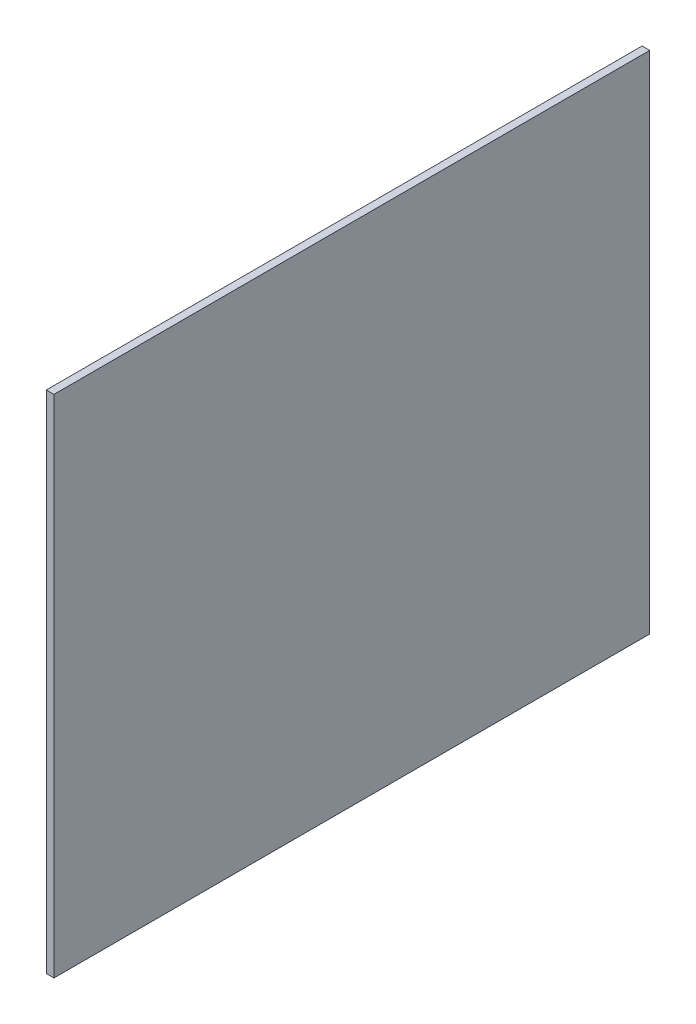
ISO-10303-21;
HEADER;
FILE_DESCRIPTION(('STEP AP214'),'2;1');
FILE_NAME('part.step','',(''),(''),'','','');
FILE_SCHEMA(('AUTOMOTIVE_DESIGN { 1 0 10303 214 1 1 1 1 }'));
ENDSEC;
DATA;
#1=APPLICATION_CONTEXT('core data for automotive mechanical design processes');
#2=APPLICATION_PROTOCOL_DEFINITION('international standard','automotive_design',2000,#1);
#3=PRODUCT_CONTEXT('',#1,'mechanical');
#4=PRODUCT('Part','Part','',(#3));
#5=PRODUCT_RELATED_PRODUCT_CATEGORY('part','',(#4));
#6=PRODUCT_DEFINITION_FORMATION('','',#4);
#7=PRODUCT_DEFINITION_CONTEXT('part definition',#1,'design');
#8=PRODUCT_DEFINITION('design','',#6,#7);
#9=PRODUCT_DEFINITION_SHAPE('','',#8);
#10=(LENGTH_UNIT() NAMED_UNIT(*) SI_UNIT(.MILLI.,.METRE.));
#11=(NAMED_UNIT(*) PLANE_ANGLE_UNIT() SI_UNIT($,.RADIAN.));
#12=(NAMED_UNIT(*) SI_UNIT($,.STERADIAN.) SOLID_ANGLE_UNIT());
#13=UNCERTAINTY_MEASURE_WITH_UNIT(LENGTH_MEASURE(1.E-05),#10,'distance_accuracy_value','');
#14=(GEOMETRIC_REPRESENTATION_CONTEXT(3) GLOBAL_UNCERTAINTY_ASSIGNED_CONTEXT((#13)) GLOBAL_UNIT_ASSIGNED_CONTEXT((#10,
#11,#12)) REPRESENTATION_CONTEXT('',''));
#15=CARTESIAN_POINT('',(0.,0.,0.));
#16=DIRECTION('',(0.,0.,1.));
#17=DIRECTION('',(1.,0.,0.));
#18=AXIS2_PLACEMENT_3D('',#15,#16,#17);
#19=CARTESIAN_POINT('',(1.5875,-52.578,-61.976));
#20=DIRECTION('',(0.,0.,1.));
#21=DIRECTION('',(1.,0.,0.));
#22=AXIS2_PLACEMENT_3D('',#19,#20,#21);
#23=PLANE('',#22);
#24=DIRECTION('',(0.,1.,0.));
#25=VECTOR('',#24,1.);
#26=CARTESIAN_POINT('',(0.,-52.578,-61.976));
#27=LINE('',#26,#25);
#28=CARTESIAN_POINT('',(0.,-52.578,-61.976));
#29=VERTEX_POINT('',#28);
#30=CARTESIAN_POINT('',(0.,52.578,-61.976));
#31=VERTEX_POINT('',#30);
#32=EDGE_CURVE('E119',#29,#31,#27,.T.);
#33=ORIENTED_EDGE('',*,*,#32,.T.);
#34=DIRECTION('',(-1.,0.,0.));
#35=VECTOR('',#34,1.);
#36=CARTESIAN_POINT('',(1.5875,52.578,-61.976));
#37=LINE('',#36,#35);
#38=CARTESIAN_POINT('',(1.5875,52.578,-61.976));
#39=VERTEX_POINT('',#38);
#40=EDGE_CURVE('E11',#39,#31,#37,.T.);
#41=ORIENTED_EDGE('',*,*,#40,.F.);
#42=DIRECTION('',(0.,1.,0.));
#43=VECTOR('',#42,1.);
#44=CARTESIAN_POINT('',(1.5875,-52.578,-61.976));
#45=LINE('',#44,#43);
#46=CARTESIAN_POINT('',(1.5875,-52.578,-61.976));
#47=VERTEX_POINT('',#46);
#48=EDGE_CURVE('E102',#47,#39,#45,.T.);
#49=ORIENTED_EDGE('',*,*,#48,.F.);
#50=DIRECTION('',(-1.,0.,0.));
#51=VECTOR('',#50,1.);
#52=CARTESIAN_POINT('',(1.5875,-52.578,-61.976));
#53=LINE('',#52,#51);
#54=EDGE_CURVE('E115',#47,#29,#53,.T.);
#55=ORIENTED_EDGE('',*,*,#54,.T.);
#56=EDGE_LOOP('',(#33,#41,#49,#55));
#57=FACE_BOUND('',#56,.T.);
#58=ADVANCED_FACE('F43',(#57),#23,.F.);
#59=CARTESIAN_POINT('',(1.5875,52.578,61.976));
#60=DIRECTION('',(0.,-1.,0.));
#61=DIRECTION('',(0.,0.,-1.));
#62=AXIS2_PLACEMENT_3D('',#59,#60,#61);
#63=PLANE('',#62);
#64=DIRECTION('',(0.,0.,1.));
#65=VECTOR('',#64,1.);
#66=CARTESIAN_POINT('',(0.,52.578,61.976));
#67=LINE('',#66,#65);
#68=CARTESIAN_POINT('',(0.,52.578,61.976));
#69=VERTEX_POINT('',#68);
#70=EDGE_CURVE('E107',#31,#69,#67,.T.);
#71=ORIENTED_EDGE('',*,*,#70,.T.);
#72=DIRECTION('',(-1.,0.,0.));
#73=VECTOR('',#72,1.);
#74=CARTESIAN_POINT('',(1.5875,52.578,61.976));
#75=LINE('',#74,#73);
#76=CARTESIAN_POINT('',(1.5875,52.578,61.976));
#77=VERTEX_POINT('',#76);
#78=EDGE_CURVE('E52',#77,#69,#75,.T.);
#79=ORIENTED_EDGE('',*,*,#78,.F.);
#80=DIRECTION('',(0.,0.,1.));
#81=VECTOR('',#80,1.);
#82=CARTESIAN_POINT('',(1.5875,52.578,61.976));
#83=LINE('',#82,#81);
#84=EDGE_CURVE('E97',#39,#77,#83,.T.);
#85=ORIENTED_EDGE('',*,*,#84,.F.);
#86=ORIENTED_EDGE('',*,*,#40,.T.);
#87=EDGE_LOOP('',(#71,#79,#85,#86));
#88=FACE_BOUND('',#87,.T.);
#89=ADVANCED_FACE('F106',(#88),#63,.F.);
#90=CARTESIAN_POINT('',(1.5875,-52.578,61.976));
#91=DIRECTION('',(0.,0.,-1.));
#92=DIRECTION('',(-1.,0.,0.));
#93=AXIS2_PLACEMENT_3D('',#90,#91,#92);
#94=PLANE('',#93);
#95=DIRECTION('',(0.,-1.,0.));
#96=VECTOR('',#95,1.);
#97=CARTESIAN_POINT('',(0.,-52.578,61.976));
#98=LINE('',#97,#96);
#99=CARTESIAN_POINT('',(0.,-52.578,61.976));
#100=VERTEX_POINT('',#99);
#101=EDGE_CURVE('E83',#69,#100,#98,.T.);
#102=ORIENTED_EDGE('',*,*,#101,.T.);
#103=DIRECTION('',(-1.,0.,0.));
#104=VECTOR('',#103,1.);
#105=CARTESIAN_POINT('',(1.5875,-52.578,61.976));
#106=LINE('',#105,#104);
#107=CARTESIAN_POINT('',(1.5875,-52.578,61.976));
#108=VERTEX_POINT('',#107);
#109=EDGE_CURVE('E109',#108,#100,#106,.T.);
#110=ORIENTED_EDGE('',*,*,#109,.F.);
#111=DIRECTION('',(0.,-1.,0.));
#112=VECTOR('',#111,1.);
#113=CARTESIAN_POINT('',(1.5875,-52.578,61.976));
#114=LINE('',#113,#112);
#115=EDGE_CURVE('E100',#77,#108,#114,.T.);
#116=ORIENTED_EDGE('',*,*,#115,.F.);
#117=ORIENTED_EDGE('',*,*,#78,.T.);
#118=EDGE_LOOP('',(#102,#110,#116,#117));
#119=FACE_BOUND('',#118,.T.);
#120=ADVANCED_FACE('F110',(#119),#94,.F.);
#121=CARTESIAN_POINT('',(1.5875,-52.578,61.976));
#122=DIRECTION('',(0.,1.,0.));
#123=DIRECTION('',(0.,0.,1.));
#124=AXIS2_PLACEMENT_3D('',#121,#122,#123);
#125=PLANE('',#124);
#126=DIRECTION('',(0.,0.,-1.));
#127=VECTOR('',#126,1.);
#128=CARTESIAN_POINT('',(0.,-52.578,61.976));
#129=LINE('',#128,#127);
#130=EDGE_CURVE('E90',#100,#29,#129,.T.);
#131=ORIENTED_EDGE('',*,*,#130,.T.);
#132=ORIENTED_EDGE('',*,*,#54,.F.);
#133=DIRECTION('',(0.,0.,-1.));
#134=VECTOR('',#133,1.);
#135=CARTESIAN_POINT('',(1.5875,-52.578,61.976));
#136=LINE('',#135,#134);
#137=EDGE_CURVE('E63',#108,#47,#136,.T.);
#138=ORIENTED_EDGE('',*,*,#137,.F.);
#139=ORIENTED_EDGE('',*,*,#109,.T.);
#140=EDGE_LOOP('',(#131,#132,#138,#139));
#141=FACE_BOUND('',#140,.T.);
#142=ADVANCED_FACE('F132',(#141),#125,.F.);
#143=CARTESIAN_POINT('',(1.5875,0.,0.));
#144=DIRECTION('',(-1.,0.,0.));
#145=DIRECTION('',(0.,0.,1.));
#146=AXIS2_PLACEMENT_3D('',#143,#144,#145);
#147=PLANE('',#146);
#148=ORIENTED_EDGE('',*,*,#48,.T.);
#149=ORIENTED_EDGE('',*,*,#84,.T.);
#150=ORIENTED_EDGE('',*,*,#115,.T.);
#151=ORIENTED_EDGE('',*,*,#137,.T.);
#152=EDGE_LOOP('',(#148,#149,#150,#151));
#153=FACE_BOUND('',#152,.T.);
#154=ADVANCED_FACE('F98',(#153),#147,.F.);
#155=CARTESIAN_POINT('',(0.,0.,0.));
#156=DIRECTION('',(-1.,0.,0.));
#157=DIRECTION('',(0.,0.,1.));
#158=AXIS2_PLACEMENT_3D('',#155,#156,#157);
#159=PLANE('',#158);
#160=ORIENTED_EDGE('',*,*,#32,.F.);
#161=ORIENTED_EDGE('',*,*,#130,.F.);
#162=ORIENTED_EDGE('',*,*,#101,.F.);
#163=ORIENTED_EDGE('',*,*,#70,.F.);
#164=EDGE_LOOP('',(#160,#161,#162,#163));
#165=FACE_BOUND('',#164,.T.);
#166=ADVANCED_FACE('F135',(#165),#159,.T.);
#167=CLOSED_SHELL('',(#58,#89,#120,#142,#154,#166));
#168=MANIFOLD_SOLID_BREP('B2',#167);
#169=ADVANCED_BREP_SHAPE_REPRESENTATION('',(#18,#168),#14);
#170=SHAPE_DEFINITION_REPRESENTATION(#9,#169);
ENDSEC;
END-ISO-10303-21;
